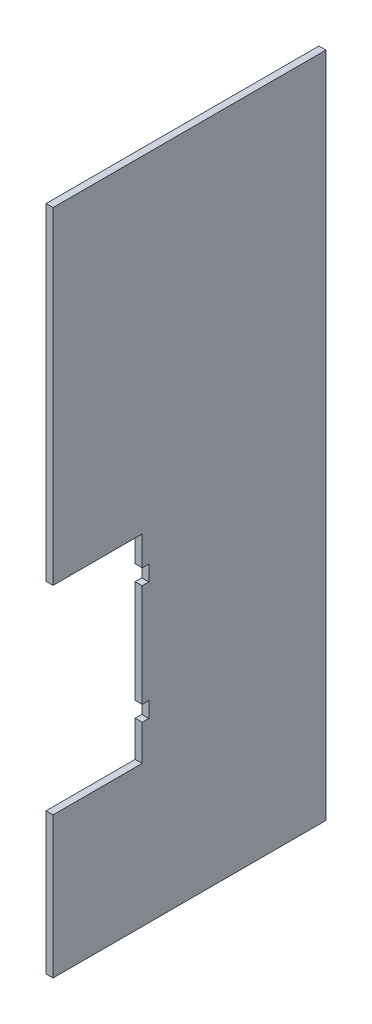
ISO-10303-21;
HEADER;
FILE_DESCRIPTION(('STEP AP214'),'2;1');
FILE_NAME('part.step','',(''),(''),'','','');
FILE_SCHEMA(('AUTOMOTIVE_DESIGN { 1 0 10303 214 1 1 1 1 }'));
ENDSEC;
DATA;
#1=APPLICATION_CONTEXT('core data for automotive mechanical design processes');
#2=APPLICATION_PROTOCOL_DEFINITION('international standard','automotive_design',2000,#1);
#3=PRODUCT_CONTEXT('',#1,'mechanical');
#4=PRODUCT('Part','Part','',(#3));
#5=PRODUCT_RELATED_PRODUCT_CATEGORY('part','',(#4));
#6=PRODUCT_DEFINITION_FORMATION('','',#4);
#7=PRODUCT_DEFINITION_CONTEXT('part definition',#1,'design');
#8=PRODUCT_DEFINITION('design','',#6,#7);
#9=PRODUCT_DEFINITION_SHAPE('','',#8);
#10=(LENGTH_UNIT() NAMED_UNIT(*) SI_UNIT(.MILLI.,.METRE.));
#11=(NAMED_UNIT(*) PLANE_ANGLE_UNIT() SI_UNIT($,.RADIAN.));
#12=(NAMED_UNIT(*) SI_UNIT($,.STERADIAN.) SOLID_ANGLE_UNIT());
#13=UNCERTAINTY_MEASURE_WITH_UNIT(LENGTH_MEASURE(1.E-05),#10,'distance_accuracy_value','');
#14=(GEOMETRIC_REPRESENTATION_CONTEXT(3) GLOBAL_UNCERTAINTY_ASSIGNED_CONTEXT((#13)) GLOBAL_UNIT_ASSIGNED_CONTEXT((#10,
#11,#12)) REPRESENTATION_CONTEXT('',''));
#15=CARTESIAN_POINT('',(0.,0.,0.));
#16=DIRECTION('',(0.,0.,1.));
#17=DIRECTION('',(1.,0.,0.));
#18=AXIS2_PLACEMENT_3D('',#15,#16,#17);
#19=CARTESIAN_POINT('',(1.,5.85000000000012,42.25));
#20=DIRECTION('',(0.,0.,1.));
#21=DIRECTION('',(0.,-1.,0.));
#22=AXIS2_PLACEMENT_3D('',#19,#20,#21);
#23=PLANE('',#22);
#24=DIRECTION('',(1.,0.,0.));
#25=VECTOR('',#24,1.);
#26=CARTESIAN_POINT('',(1.,25.9691599433872,42.25));
#27=LINE('',#26,#25);
#28=CARTESIAN_POINT('',(0.,25.9691599433872,42.25));
#29=VERTEX_POINT('',#28);
#30=CARTESIAN_POINT('',(1.,25.9691599433872,42.25));
#31=VERTEX_POINT('',#30);
#32=EDGE_CURVE('E237',#29,#31,#27,.T.);
#33=ORIENTED_EDGE('',*,*,#32,.F.);
#34=DIRECTION('',(0.,1.,0.));
#35=VECTOR('',#34,1.);
#36=CARTESIAN_POINT('',(0.,100.85,42.25));
#37=LINE('',#36,#35);
#38=CARTESIAN_POINT('',(0.,5.85000000000012,42.25));
#39=VERTEX_POINT('',#38);
#40=EDGE_CURVE('E240',#39,#29,#37,.T.);
#41=ORIENTED_EDGE('',*,*,#40,.F.);
#42=DIRECTION('',(-1.,0.,0.));
#43=VECTOR('',#42,1.);
#44=CARTESIAN_POINT('',(1.,5.85000000000012,42.25));
#45=LINE('',#44,#43);
#46=CARTESIAN_POINT('',(1.,5.85000000000012,42.25));
#47=VERTEX_POINT('',#46);
#48=EDGE_CURVE('E263',#47,#39,#45,.T.);
#49=ORIENTED_EDGE('',*,*,#48,.F.);
#50=DIRECTION('',(0.,1.,0.));
#51=VECTOR('',#50,1.);
#52=CARTESIAN_POINT('',(1.,5.85000000000012,42.25));
#53=LINE('',#52,#51);
#54=EDGE_CURVE('E254',#47,#31,#53,.T.);
#55=ORIENTED_EDGE('',*,*,#54,.T.);
#56=EDGE_LOOP('',(#33,#41,#49,#55));
#57=FACE_BOUND('',#56,.T.);
#58=ADVANCED_FACE('F32',(#57),#23,.T.);
#59=CARTESIAN_POINT('',(1.,5.85000000000011,3.40000000000003));
#60=DIRECTION('',(0.,-1.,0.));
#61=DIRECTION('',(0.,0.,-1.));
#62=AXIS2_PLACEMENT_3D('',#59,#60,#61);
#63=PLANE('',#62);
#64=ORIENTED_EDGE('',*,*,#48,.T.);
#65=DIRECTION('',(0.,0.,1.));
#66=VECTOR('',#65,1.);
#67=CARTESIAN_POINT('',(0.,5.85000000000012,42.25));
#68=LINE('',#67,#66);
#69=CARTESIAN_POINT('',(0.,5.85000000000011,3.40000000000002));
#70=VERTEX_POINT('',#69);
#71=EDGE_CURVE('E249',#70,#39,#68,.T.);
#72=ORIENTED_EDGE('',*,*,#71,.F.);
#73=DIRECTION('',(-1.,0.,0.));
#74=VECTOR('',#73,1.);
#75=CARTESIAN_POINT('',(1.,5.85000000000011,3.40000000000003));
#76=LINE('',#75,#74);
#77=CARTESIAN_POINT('',(1.,5.85000000000011,3.40000000000003));
#78=VERTEX_POINT('',#77);
#79=EDGE_CURVE('E40',#78,#70,#76,.T.);
#80=ORIENTED_EDGE('',*,*,#79,.F.);
#81=DIRECTION('',(0.,0.,1.));
#82=VECTOR('',#81,1.);
#83=CARTESIAN_POINT('',(1.,5.85000000000011,3.40000000000003));
#84=LINE('',#83,#82);
#85=EDGE_CURVE('E252',#78,#47,#84,.T.);
#86=ORIENTED_EDGE('',*,*,#85,.T.);
#87=EDGE_LOOP('',(#64,#72,#80,#86));
#88=FACE_BOUND('',#87,.T.);
#89=ADVANCED_FACE('F34',(#88),#63,.T.);
#90=CARTESIAN_POINT('',(1.,100.85,3.40000000000002));
#91=DIRECTION('',(0.,0.,-1.));
#92=DIRECTION('',(0.,1.,0.));
#93=AXIS2_PLACEMENT_3D('',#90,#91,#92);
#94=PLANE('',#93);
#95=ORIENTED_EDGE('',*,*,#79,.T.);
#96=DIRECTION('',(0.,-1.,0.));
#97=VECTOR('',#96,1.);
#98=CARTESIAN_POINT('',(0.,5.85000000000011,3.40000000000002));
#99=LINE('',#98,#97);
#100=CARTESIAN_POINT('',(0.,100.85,3.40000000000002));
#101=VERTEX_POINT('',#100);
#102=EDGE_CURVE('E246',#101,#70,#99,.T.);
#103=ORIENTED_EDGE('',*,*,#102,.F.);
#104=DIRECTION('',(-1.,0.,0.));
#105=VECTOR('',#104,1.);
#106=CARTESIAN_POINT('',(1.,100.85,3.40000000000002));
#107=LINE('',#106,#105);
#108=CARTESIAN_POINT('',(1.,100.85,3.40000000000002));
#109=VERTEX_POINT('',#108);
#110=EDGE_CURVE('E265',#109,#101,#107,.T.);
#111=ORIENTED_EDGE('',*,*,#110,.F.);
#112=DIRECTION('',(0.,-1.,0.));
#113=VECTOR('',#112,1.);
#114=CARTESIAN_POINT('',(1.,100.85,3.40000000000002));
#115=LINE('',#114,#113);
#116=EDGE_CURVE('E260',#109,#78,#115,.T.);
#117=ORIENTED_EDGE('',*,*,#116,.T.);
#118=EDGE_LOOP('',(#95,#103,#111,#117));
#119=FACE_BOUND('',#118,.T.);
#120=ADVANCED_FACE('F324',(#119),#94,.T.);
#121=CARTESIAN_POINT('',(1.,100.85,42.25));
#122=DIRECTION('',(0.,1.,0.));
#123=DIRECTION('',(0.,0.,1.));
#124=AXIS2_PLACEMENT_3D('',#121,#122,#123);
#125=PLANE('',#124);
#126=ORIENTED_EDGE('',*,*,#110,.T.);
#127=DIRECTION('',(0.,0.,-1.));
#128=VECTOR('',#127,1.);
#129=CARTESIAN_POINT('',(0.,100.85,3.40000000000002));
#130=LINE('',#129,#128);
#131=CARTESIAN_POINT('',(0.,100.85,42.25));
#132=VERTEX_POINT('',#131);
#133=EDGE_CURVE('E243',#132,#101,#130,.T.);
#134=ORIENTED_EDGE('',*,*,#133,.F.);
#135=DIRECTION('',(-1.,0.,0.));
#136=VECTOR('',#135,1.);
#137=CARTESIAN_POINT('',(1.,100.85,42.25));
#138=LINE('',#137,#136);
#139=CARTESIAN_POINT('',(1.,100.85,42.25));
#140=VERTEX_POINT('',#139);
#141=EDGE_CURVE('E267',#140,#132,#138,.T.);
#142=ORIENTED_EDGE('',*,*,#141,.F.);
#143=DIRECTION('',(0.,0.,-1.));
#144=VECTOR('',#143,1.);
#145=CARTESIAN_POINT('',(1.,100.85,42.25));
#146=LINE('',#145,#144);
#147=EDGE_CURVE('E257',#140,#109,#146,.T.);
#148=ORIENTED_EDGE('',*,*,#147,.T.);
#149=EDGE_LOOP('',(#126,#134,#142,#148));
#150=FACE_BOUND('',#149,.T.);
#151=ADVANCED_FACE('F327',(#150),#125,.T.);
#152=DIRECTION('',(-1.,0.,0.));
#153=VECTOR('',#152,1.);
#154=CARTESIAN_POINT('',(1.,54.2619783963912,42.25));
#155=LINE('',#154,#153);
#156=CARTESIAN_POINT('',(1.,54.2619783963912,42.25));
#157=VERTEX_POINT('',#156);
#158=CARTESIAN_POINT('',(0.,54.2619783963912,42.25));
#159=VERTEX_POINT('',#158);
#160=EDGE_CURVE('E47',#157,#159,#155,.T.);
#161=ORIENTED_EDGE('',*,*,#160,.F.);
#162=EDGE_CURVE('E165',#157,#140,#53,.T.);
#163=ORIENTED_EDGE('',*,*,#162,.T.);
#164=ORIENTED_EDGE('',*,*,#141,.T.);
#165=EDGE_CURVE('E239',#159,#132,#37,.T.);
#166=ORIENTED_EDGE('',*,*,#165,.F.);
#167=EDGE_LOOP('',(#161,#163,#164,#166));
#168=FACE_BOUND('',#167,.T.);
#169=ADVANCED_FACE('F320',(#168),#23,.T.);
#170=CARTESIAN_POINT('',(1.,0.,0.));
#171=DIRECTION('',(-1.,0.,0.));
#172=DIRECTION('',(0.,0.,1.));
#173=AXIS2_PLACEMENT_3D('',#170,#171,#172);
#174=PLANE('',#173);
#175=DIRECTION('',(0.,-1.,0.));
#176=VECTOR('',#175,1.);
#177=CARTESIAN_POINT('',(1.,31.0387265210751,29.5622880308028));
#178=LINE('',#177,#176);
#179=CARTESIAN_POINT('',(1.,31.0387265210751,29.5622880308028));
#180=VERTEX_POINT('',#179);
#181=CARTESIAN_POINT('',(1.,25.9691599433872,29.5622880308028));
#182=VERTEX_POINT('',#181);
#183=EDGE_CURVE('E190',#180,#182,#178,.T.);
#184=ORIENTED_EDGE('',*,*,#183,.T.);
#185=DIRECTION('',(0.,0.,1.));
#186=VECTOR('',#185,1.);
#187=CARTESIAN_POINT('',(1.,25.9691599433872,47.1871750149511));
#188=LINE('',#187,#186);
#189=EDGE_CURVE('E151',#182,#31,#188,.T.);
#190=ORIENTED_EDGE('',*,*,#189,.T.);
#191=ORIENTED_EDGE('',*,*,#54,.F.);
#192=ORIENTED_EDGE('',*,*,#85,.F.);
#193=ORIENTED_EDGE('',*,*,#116,.F.);
#194=ORIENTED_EDGE('',*,*,#147,.F.);
#195=ORIENTED_EDGE('',*,*,#162,.F.);
#196=DIRECTION('',(0.,0.,-1.));
#197=VECTOR('',#196,1.);
#198=CARTESIAN_POINT('',(1.,54.2619783963912,47.1871750149511));
#199=LINE('',#198,#197);
#200=CARTESIAN_POINT('',(1.,54.2619783963912,29.5622880308028));
#201=VERTEX_POINT('',#200);
#202=EDGE_CURVE('E146',#157,#201,#199,.T.);
#203=ORIENTED_EDGE('',*,*,#202,.T.);
#204=DIRECTION('',(0.,-1.,0.));
#205=VECTOR('',#204,1.);
#206=CARTESIAN_POINT('',(1.,54.2619783963912,29.5622880308028));
#207=LINE('',#206,#205);
#208=CARTESIAN_POINT('',(1.,50.0787265210751,29.5622880308028));
#209=VERTEX_POINT('',#208);
#210=EDGE_CURVE('E154',#201,#209,#207,.T.);
#211=ORIENTED_EDGE('',*,*,#210,.T.);
#212=DIRECTION('',(0.,0.,-1.));
#213=VECTOR('',#212,1.);
#214=CARTESIAN_POINT('',(1.,50.0787265210751,29.5622880308028));
#215=LINE('',#214,#213);
#216=CARTESIAN_POINT('',(1.,50.0787265210751,28.6188892282582));
#217=VERTEX_POINT('',#216);
#218=EDGE_CURVE('E159',#209,#217,#215,.T.);
#219=ORIENTED_EDGE('',*,*,#218,.T.);
#220=DIRECTION('',(0.,-1.,0.));
#221=VECTOR('',#220,1.);
#222=CARTESIAN_POINT('',(1.,50.0787265210751,28.6188892282582));
#223=LINE('',#222,#221);
#224=CARTESIAN_POINT('',(1.,47.8787265210751,28.6188892282582));
#225=VERTEX_POINT('',#224);
#226=EDGE_CURVE('E172',#217,#225,#223,.T.);
#227=ORIENTED_EDGE('',*,*,#226,.T.);
#228=DIRECTION('',(0.,0.,1.));
#229=VECTOR('',#228,1.);
#230=CARTESIAN_POINT('',(1.,47.8787265210751,28.6188892282582));
#231=LINE('',#230,#229);
#232=CARTESIAN_POINT('',(1.,47.8787265210751,29.5622880308028));
#233=VERTEX_POINT('',#232);
#234=EDGE_CURVE('E175',#225,#233,#231,.T.);
#235=ORIENTED_EDGE('',*,*,#234,.T.);
#236=DIRECTION('',(0.,-1.,0.));
#237=VECTOR('',#236,1.);
#238=CARTESIAN_POINT('',(1.,47.8787265210751,29.5622880308028));
#239=LINE('',#238,#237);
#240=CARTESIAN_POINT('',(1.,33.2387265210751,29.5622880308028));
#241=VERTEX_POINT('',#240);
#242=EDGE_CURVE('E178',#233,#241,#239,.T.);
#243=ORIENTED_EDGE('',*,*,#242,.T.);
#244=DIRECTION('',(0.,0.,-1.));
#245=VECTOR('',#244,1.);
#246=CARTESIAN_POINT('',(1.,33.2387265210751,29.5622880308028));
#247=LINE('',#246,#245);
#248=CARTESIAN_POINT('',(1.,33.2387265210751,28.6188892282582));
#249=VERTEX_POINT('',#248);
#250=EDGE_CURVE('E181',#241,#249,#247,.T.);
#251=ORIENTED_EDGE('',*,*,#250,.T.);
#252=DIRECTION('',(0.,-1.,0.));
#253=VECTOR('',#252,1.);
#254=CARTESIAN_POINT('',(1.,33.2387265210751,28.6188892282582));
#255=LINE('',#254,#253);
#256=CARTESIAN_POINT('',(1.,31.0387265210751,28.6188892282582));
#257=VERTEX_POINT('',#256);
#258=EDGE_CURVE('E184',#249,#257,#255,.T.);
#259=ORIENTED_EDGE('',*,*,#258,.T.);
#260=DIRECTION('',(0.,0.,1.));
#261=VECTOR('',#260,1.);
#262=CARTESIAN_POINT('',(1.,31.0387265210751,28.6188892282582));
#263=LINE('',#262,#261);
#264=EDGE_CURVE('E187',#257,#180,#263,.T.);
#265=ORIENTED_EDGE('',*,*,#264,.T.);
#266=EDGE_LOOP('',(#184,#190,#191,#192,#193,#194,#195,#203,#211,#219,#227,#235,#243,#251,#259,#265));
#267=FACE_BOUND('',#266,.T.);
#268=ADVANCED_FACE('F163',(#267),#174,.F.);
#269=CARTESIAN_POINT('',(0.,0.,0.));
#270=DIRECTION('',(1.,0.,0.));
#271=DIRECTION('',(0.,0.,-1.));
#272=AXIS2_PLACEMENT_3D('',#269,#270,#271);
#273=PLANE('',#272);
#274=ORIENTED_EDGE('',*,*,#40,.T.);
#275=DIRECTION('',(0.,0.,1.));
#276=VECTOR('',#275,1.);
#277=CARTESIAN_POINT('',(0.,25.9691599433872,47.1871750149511));
#278=LINE('',#277,#276);
#279=CARTESIAN_POINT('',(0.,25.9691599433872,29.5622880308028));
#280=VERTEX_POINT('',#279);
#281=EDGE_CURVE('E166',#280,#29,#278,.T.);
#282=ORIENTED_EDGE('',*,*,#281,.F.);
#283=DIRECTION('',(0.,-1.,0.));
#284=VECTOR('',#283,1.);
#285=CARTESIAN_POINT('',(0.,31.0387265210751,29.5622880308028));
#286=LINE('',#285,#284);
#287=CARTESIAN_POINT('',(0.,31.0387265210751,29.5622880308028));
#288=VERTEX_POINT('',#287);
#289=EDGE_CURVE('E168',#288,#280,#286,.T.);
#290=ORIENTED_EDGE('',*,*,#289,.F.);
#291=DIRECTION('',(0.,0.,1.));
#292=VECTOR('',#291,1.);
#293=CARTESIAN_POINT('',(0.,31.0387265210751,28.6188892282582));
#294=LINE('',#293,#292);
#295=CARTESIAN_POINT('',(0.,31.0387265210751,28.6188892282582));
#296=VERTEX_POINT('',#295);
#297=EDGE_CURVE('E214',#296,#288,#294,.T.);
#298=ORIENTED_EDGE('',*,*,#297,.F.);
#299=DIRECTION('',(0.,-1.,0.));
#300=VECTOR('',#299,1.);
#301=CARTESIAN_POINT('',(0.,33.2387265210751,28.6188892282582));
#302=LINE('',#301,#300);
#303=CARTESIAN_POINT('',(0.,33.2387265210751,28.6188892282582));
#304=VERTEX_POINT('',#303);
#305=EDGE_CURVE('E211',#304,#296,#302,.T.);
#306=ORIENTED_EDGE('',*,*,#305,.F.);
#307=DIRECTION('',(0.,0.,-1.));
#308=VECTOR('',#307,1.);
#309=CARTESIAN_POINT('',(0.,33.2387265210751,29.5622880308028));
#310=LINE('',#309,#308);
#311=CARTESIAN_POINT('',(0.,33.2387265210751,29.5622880308028));
#312=VERTEX_POINT('',#311);
#313=EDGE_CURVE('E208',#312,#304,#310,.T.);
#314=ORIENTED_EDGE('',*,*,#313,.F.);
#315=DIRECTION('',(0.,-1.,0.));
#316=VECTOR('',#315,1.);
#317=CARTESIAN_POINT('',(0.,47.8787265210751,29.5622880308028));
#318=LINE('',#317,#316);
#319=CARTESIAN_POINT('',(0.,47.8787265210751,29.5622880308028));
#320=VERTEX_POINT('',#319);
#321=EDGE_CURVE('E205',#320,#312,#318,.T.);
#322=ORIENTED_EDGE('',*,*,#321,.F.);
#323=DIRECTION('',(0.,0.,1.));
#324=VECTOR('',#323,1.);
#325=CARTESIAN_POINT('',(0.,47.8787265210751,28.6188892282582));
#326=LINE('',#325,#324);
#327=CARTESIAN_POINT('',(0.,47.8787265210751,28.6188892282582));
#328=VERTEX_POINT('',#327);
#329=EDGE_CURVE('E202',#328,#320,#326,.T.);
#330=ORIENTED_EDGE('',*,*,#329,.F.);
#331=DIRECTION('',(0.,-1.,0.));
#332=VECTOR('',#331,1.);
#333=CARTESIAN_POINT('',(0.,50.0787265210751,28.6188892282582));
#334=LINE('',#333,#332);
#335=CARTESIAN_POINT('',(0.,50.0787265210751,28.6188892282582));
#336=VERTEX_POINT('',#335);
#337=EDGE_CURVE('E199',#336,#328,#334,.T.);
#338=ORIENTED_EDGE('',*,*,#337,.F.);
#339=DIRECTION('',(0.,0.,-1.));
#340=VECTOR('',#339,1.);
#341=CARTESIAN_POINT('',(0.,50.0787265210751,29.5622880308028));
#342=LINE('',#341,#340);
#343=CARTESIAN_POINT('',(0.,50.0787265210751,29.5622880308028));
#344=VERTEX_POINT('',#343);
#345=EDGE_CURVE('E196',#344,#336,#342,.T.);
#346=ORIENTED_EDGE('',*,*,#345,.F.);
#347=DIRECTION('',(0.,-1.,0.));
#348=VECTOR('',#347,1.);
#349=CARTESIAN_POINT('',(0.,54.2619783963912,29.5622880308028));
#350=LINE('',#349,#348);
#351=CARTESIAN_POINT('',(0.,54.2619783963912,29.5622880308028));
#352=VERTEX_POINT('',#351);
#353=EDGE_CURVE('E194',#352,#344,#350,.T.);
#354=ORIENTED_EDGE('',*,*,#353,.F.);
#355=DIRECTION('',(0.,0.,1.));
#356=VECTOR('',#355,1.);
#357=CARTESIAN_POINT('',(0.,54.2619783963912,0.));
#358=LINE('',#357,#356);
#359=EDGE_CURVE('E11',#352,#159,#358,.T.);
#360=ORIENTED_EDGE('',*,*,#359,.T.);
#361=ORIENTED_EDGE('',*,*,#165,.T.);
#362=ORIENTED_EDGE('',*,*,#133,.T.);
#363=ORIENTED_EDGE('',*,*,#102,.T.);
#364=ORIENTED_EDGE('',*,*,#71,.T.);
#365=EDGE_LOOP('',(#274,#282,#290,#298,#306,#314,#322,#330,#338,#346,#354,#360,#361,#362,#363,#364));
#366=FACE_BOUND('',#365,.T.);
#367=ADVANCED_FACE('F273',(#366),#273,.F.);
#368=CARTESIAN_POINT('',(1.,25.9691599433872,47.1871750149511));
#369=DIRECTION('',(0.,-1.,0.));
#370=DIRECTION('',(0.,0.,-1.));
#371=AXIS2_PLACEMENT_3D('',#368,#369,#370);
#372=PLANE('',#371);
#373=ORIENTED_EDGE('',*,*,#32,.T.);
#374=ORIENTED_EDGE('',*,*,#189,.F.);
#375=DIRECTION('',(-1.,0.,0.));
#376=VECTOR('',#375,1.);
#377=CARTESIAN_POINT('',(1.,25.9691599433872,29.5622880308028));
#378=LINE('',#377,#376);
#379=EDGE_CURVE('E219',#182,#280,#378,.T.);
#380=ORIENTED_EDGE('',*,*,#379,.T.);
#381=ORIENTED_EDGE('',*,*,#281,.T.);
#382=EDGE_LOOP('',(#373,#374,#380,#381));
#383=FACE_BOUND('',#382,.T.);
#384=ADVANCED_FACE('F279',(#383),#372,.F.);
#385=CARTESIAN_POINT('',(1.,31.0387265210751,29.5622880308028));
#386=DIRECTION('',(0.,0.,-1.));
#387=DIRECTION('',(-1.,0.,0.));
#388=AXIS2_PLACEMENT_3D('',#385,#386,#387);
#389=PLANE('',#388);
#390=ORIENTED_EDGE('',*,*,#289,.T.);
#391=ORIENTED_EDGE('',*,*,#379,.F.);
#392=ORIENTED_EDGE('',*,*,#183,.F.);
#393=DIRECTION('',(-1.,0.,0.));
#394=VECTOR('',#393,1.);
#395=CARTESIAN_POINT('',(1.,31.0387265210751,29.5622880308028));
#396=LINE('',#395,#394);
#397=EDGE_CURVE('E221',#180,#288,#396,.T.);
#398=ORIENTED_EDGE('',*,*,#397,.T.);
#399=EDGE_LOOP('',(#390,#391,#392,#398));
#400=FACE_BOUND('',#399,.T.);
#401=ADVANCED_FACE('F283',(#400),#389,.F.);
#402=CARTESIAN_POINT('',(1.,31.0387265210751,28.6188892282582));
#403=DIRECTION('',(0.,-1.,0.));
#404=DIRECTION('',(0.,0.,-1.));
#405=AXIS2_PLACEMENT_3D('',#402,#403,#404);
#406=PLANE('',#405);
#407=ORIENTED_EDGE('',*,*,#297,.T.);
#408=ORIENTED_EDGE('',*,*,#397,.F.);
#409=ORIENTED_EDGE('',*,*,#264,.F.);
#410=DIRECTION('',(-1.,0.,0.));
#411=VECTOR('',#410,1.);
#412=CARTESIAN_POINT('',(1.,31.0387265210751,28.6188892282582));
#413=LINE('',#412,#411);
#414=EDGE_CURVE('E223',#257,#296,#413,.T.);
#415=ORIENTED_EDGE('',*,*,#414,.T.);
#416=EDGE_LOOP('',(#407,#408,#409,#415));
#417=FACE_BOUND('',#416,.T.);
#418=ADVANCED_FACE('F289',(#417),#406,.F.);
#419=CARTESIAN_POINT('',(1.,33.2387265210751,28.6188892282582));
#420=DIRECTION('',(0.,0.,-1.));
#421=DIRECTION('',(-1.,0.,0.));
#422=AXIS2_PLACEMENT_3D('',#419,#420,#421);
#423=PLANE('',#422);
#424=ORIENTED_EDGE('',*,*,#305,.T.);
#425=ORIENTED_EDGE('',*,*,#414,.F.);
#426=ORIENTED_EDGE('',*,*,#258,.F.);
#427=DIRECTION('',(-1.,0.,0.));
#428=VECTOR('',#427,1.);
#429=CARTESIAN_POINT('',(1.,33.2387265210751,28.6188892282582));
#430=LINE('',#429,#428);
#431=EDGE_CURVE('E225',#249,#304,#430,.T.);
#432=ORIENTED_EDGE('',*,*,#431,.T.);
#433=EDGE_LOOP('',(#424,#425,#426,#432));
#434=FACE_BOUND('',#433,.T.);
#435=ADVANCED_FACE('F292',(#434),#423,.F.);
#436=CARTESIAN_POINT('',(1.,33.2387265210751,29.5622880308028));
#437=DIRECTION('',(0.,1.,0.));
#438=DIRECTION('',(0.,0.,1.));
#439=AXIS2_PLACEMENT_3D('',#436,#437,#438);
#440=PLANE('',#439);
#441=ORIENTED_EDGE('',*,*,#313,.T.);
#442=ORIENTED_EDGE('',*,*,#431,.F.);
#443=ORIENTED_EDGE('',*,*,#250,.F.);
#444=DIRECTION('',(-1.,0.,0.));
#445=VECTOR('',#444,1.);
#446=CARTESIAN_POINT('',(1.,33.2387265210751,29.5622880308028));
#447=LINE('',#446,#445);
#448=EDGE_CURVE('E227',#241,#312,#447,.T.);
#449=ORIENTED_EDGE('',*,*,#448,.T.);
#450=EDGE_LOOP('',(#441,#442,#443,#449));
#451=FACE_BOUND('',#450,.T.);
#452=ADVANCED_FACE('F295',(#451),#440,.F.);
#453=CARTESIAN_POINT('',(1.,47.8787265210751,29.5622880308028));
#454=DIRECTION('',(0.,0.,-1.));
#455=DIRECTION('',(0.,1.,0.));
#456=AXIS2_PLACEMENT_3D('',#453,#454,#455);
#457=PLANE('',#456);
#458=ORIENTED_EDGE('',*,*,#321,.T.);
#459=ORIENTED_EDGE('',*,*,#448,.F.);
#460=ORIENTED_EDGE('',*,*,#242,.F.);
#461=DIRECTION('',(-1.,0.,0.));
#462=VECTOR('',#461,1.);
#463=CARTESIAN_POINT('',(1.,47.8787265210751,29.5622880308028));
#464=LINE('',#463,#462);
#465=EDGE_CURVE('E229',#233,#320,#464,.T.);
#466=ORIENTED_EDGE('',*,*,#465,.T.);
#467=EDGE_LOOP('',(#458,#459,#460,#466));
#468=FACE_BOUND('',#467,.T.);
#469=ADVANCED_FACE('F300',(#468),#457,.F.);
#470=CARTESIAN_POINT('',(1.,47.8787265210751,28.6188892282582));
#471=DIRECTION('',(0.,-1.,0.));
#472=DIRECTION('',(0.,0.,-1.));
#473=AXIS2_PLACEMENT_3D('',#470,#471,#472);
#474=PLANE('',#473);
#475=ORIENTED_EDGE('',*,*,#329,.T.);
#476=ORIENTED_EDGE('',*,*,#465,.F.);
#477=ORIENTED_EDGE('',*,*,#234,.F.);
#478=DIRECTION('',(-1.,0.,0.));
#479=VECTOR('',#478,1.);
#480=CARTESIAN_POINT('',(1.,47.8787265210751,28.6188892282582));
#481=LINE('',#480,#479);
#482=EDGE_CURVE('E231',#225,#328,#481,.T.);
#483=ORIENTED_EDGE('',*,*,#482,.T.);
#484=EDGE_LOOP('',(#475,#476,#477,#483));
#485=FACE_BOUND('',#484,.T.);
#486=ADVANCED_FACE('F304',(#485),#474,.F.);
#487=CARTESIAN_POINT('',(1.,50.0787265210751,28.6188892282582));
#488=DIRECTION('',(0.,0.,-1.));
#489=DIRECTION('',(-1.,0.,0.));
#490=AXIS2_PLACEMENT_3D('',#487,#488,#489);
#491=PLANE('',#490);
#492=ORIENTED_EDGE('',*,*,#337,.T.);
#493=ORIENTED_EDGE('',*,*,#482,.F.);
#494=ORIENTED_EDGE('',*,*,#226,.F.);
#495=DIRECTION('',(-1.,0.,0.));
#496=VECTOR('',#495,1.);
#497=CARTESIAN_POINT('',(1.,50.0787265210751,28.6188892282582));
#498=LINE('',#497,#496);
#499=EDGE_CURVE('E233',#217,#336,#498,.T.);
#500=ORIENTED_EDGE('',*,*,#499,.T.);
#501=EDGE_LOOP('',(#492,#493,#494,#500));
#502=FACE_BOUND('',#501,.T.);
#503=ADVANCED_FACE('F307',(#502),#491,.F.);
#504=CARTESIAN_POINT('',(1.,50.0787265210751,29.5622880308028));
#505=DIRECTION('',(0.,1.,0.));
#506=DIRECTION('',(0.,0.,1.));
#507=AXIS2_PLACEMENT_3D('',#504,#505,#506);
#508=PLANE('',#507);
#509=ORIENTED_EDGE('',*,*,#345,.T.);
#510=ORIENTED_EDGE('',*,*,#499,.F.);
#511=ORIENTED_EDGE('',*,*,#218,.F.);
#512=DIRECTION('',(-1.,0.,0.));
#513=VECTOR('',#512,1.);
#514=CARTESIAN_POINT('',(1.,50.0787265210751,29.5622880308028));
#515=LINE('',#514,#513);
#516=EDGE_CURVE('E150',#209,#344,#515,.T.);
#517=ORIENTED_EDGE('',*,*,#516,.T.);
#518=EDGE_LOOP('',(#509,#510,#511,#517));
#519=FACE_BOUND('',#518,.T.);
#520=ADVANCED_FACE('F310',(#519),#508,.F.);
#521=CARTESIAN_POINT('',(1.,54.2619783963912,29.5622880308028));
#522=DIRECTION('',(0.,0.,-1.));
#523=DIRECTION('',(-1.,0.,0.));
#524=AXIS2_PLACEMENT_3D('',#521,#522,#523);
#525=PLANE('',#524);
#526=ORIENTED_EDGE('',*,*,#353,.T.);
#527=ORIENTED_EDGE('',*,*,#516,.F.);
#528=ORIENTED_EDGE('',*,*,#210,.F.);
#529=DIRECTION('',(-1.,0.,0.));
#530=VECTOR('',#529,1.);
#531=CARTESIAN_POINT('',(1.,54.2619783963912,29.5622880308028));
#532=LINE('',#531,#530);
#533=EDGE_CURVE('E142',#201,#352,#532,.T.);
#534=ORIENTED_EDGE('',*,*,#533,.T.);
#535=EDGE_LOOP('',(#526,#527,#528,#534));
#536=FACE_BOUND('',#535,.T.);
#537=ADVANCED_FACE('F155',(#536),#525,.F.);
#538=CARTESIAN_POINT('',(1.,54.2619783963912,47.1871750149511));
#539=DIRECTION('',(0.,1.,0.));
#540=DIRECTION('',(0.,0.,1.));
#541=AXIS2_PLACEMENT_3D('',#538,#539,#540);
#542=PLANE('',#541);
#543=ORIENTED_EDGE('',*,*,#160,.T.);
#544=ORIENTED_EDGE('',*,*,#359,.F.);
#545=ORIENTED_EDGE('',*,*,#533,.F.);
#546=ORIENTED_EDGE('',*,*,#202,.F.);
#547=EDGE_LOOP('',(#543,#544,#545,#546));
#548=FACE_BOUND('',#547,.T.);
#549=ADVANCED_FACE('F144',(#548),#542,.F.);
#550=CLOSED_SHELL('',(#58,#89,#120,#151,#169,#268,#367,#384,#401,#418,#435,#452,#469,#486,#503,
#520,#537,#549));
#551=MANIFOLD_SOLID_BREP('B2',#550);
#552=ADVANCED_BREP_SHAPE_REPRESENTATION('',(#18,#551),#14);
#553=SHAPE_DEFINITION_REPRESENTATION(#9,#552);
ENDSEC;
END-ISO-10303-21;
